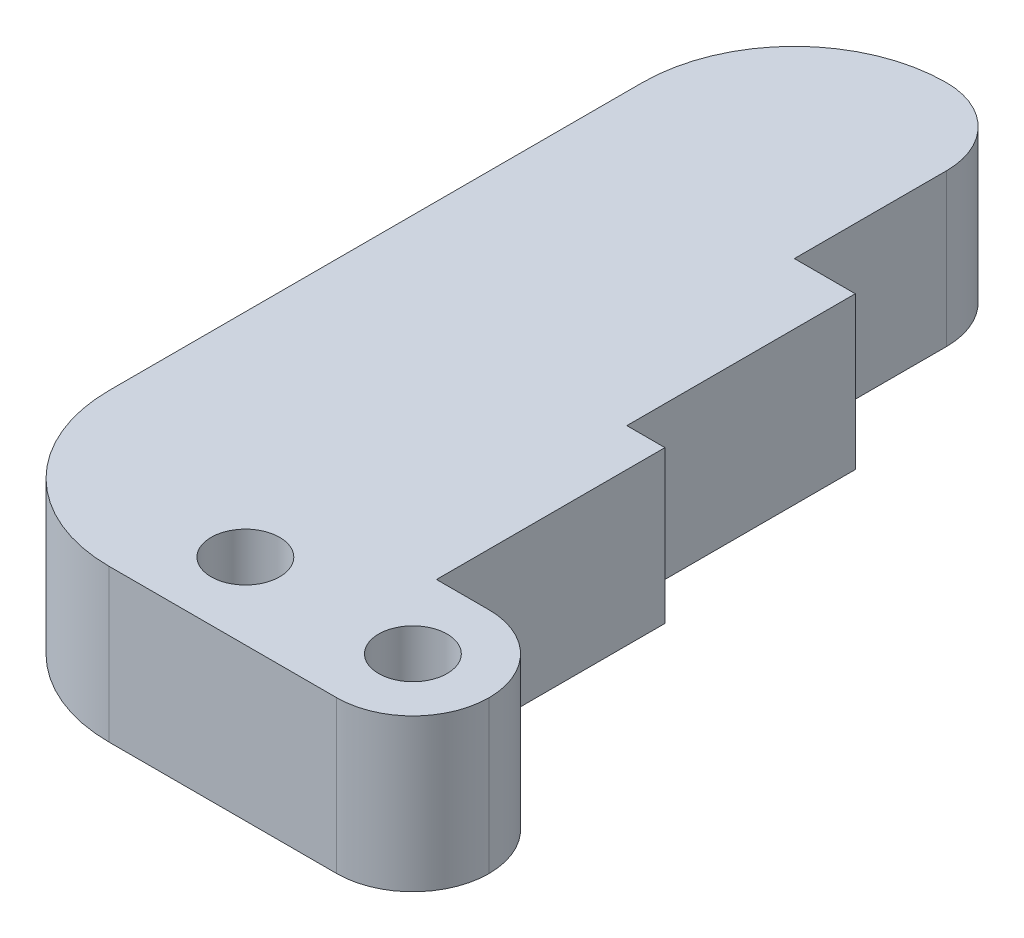
ISO-10303-21;
HEADER;
FILE_DESCRIPTION(('STEP AP214'),'2;1');
FILE_NAME('part.step','',(''),(''),'','','');
FILE_SCHEMA(('AUTOMOTIVE_DESIGN { 1 0 10303 214 1 1 1 1 }'));
ENDSEC;
DATA;
#1=APPLICATION_CONTEXT('core data for automotive mechanical design processes');
#2=APPLICATION_PROTOCOL_DEFINITION('international standard','automotive_design',2000,#1);
#3=PRODUCT_CONTEXT('',#1,'mechanical');
#4=PRODUCT('Part','Part','',(#3));
#5=PRODUCT_RELATED_PRODUCT_CATEGORY('part','',(#4));
#6=PRODUCT_DEFINITION_FORMATION('','',#4);
#7=PRODUCT_DEFINITION_CONTEXT('part definition',#1,'design');
#8=PRODUCT_DEFINITION('design','',#6,#7);
#9=PRODUCT_DEFINITION_SHAPE('','',#8);
#10=(LENGTH_UNIT() NAMED_UNIT(*) SI_UNIT(.MILLI.,.METRE.));
#11=(NAMED_UNIT(*) PLANE_ANGLE_UNIT() SI_UNIT($,.RADIAN.));
#12=(NAMED_UNIT(*) SI_UNIT($,.STERADIAN.) SOLID_ANGLE_UNIT());
#13=UNCERTAINTY_MEASURE_WITH_UNIT(LENGTH_MEASURE(1.E-05),#10,'distance_accuracy_value','');
#14=(GEOMETRIC_REPRESENTATION_CONTEXT(3) GLOBAL_UNCERTAINTY_ASSIGNED_CONTEXT((#13)) GLOBAL_UNIT_ASSIGNED_CONTEXT((#10,
#11,#12)) REPRESENTATION_CONTEXT('',''));
#15=CARTESIAN_POINT('',(0.,0.,0.));
#16=DIRECTION('',(0.,0.,1.));
#17=DIRECTION('',(1.,0.,0.));
#18=AXIS2_PLACEMENT_3D('',#15,#16,#17);
#19=CARTESIAN_POINT('',(-8.44999999999998,10.,0.));
#20=DIRECTION('',(0.,0.,1.));
#21=DIRECTION('',(1.,0.,0.));
#22=AXIS2_PLACEMENT_3D('',#19,#20,#21);
#23=PLANE('',#22);
#24=DIRECTION('',(-1.,0.,0.));
#25=VECTOR('',#24,1.);
#26=CARTESIAN_POINT('',(-8.44999999999998,10.,0.));
#27=LINE('',#26,#25);
#28=CARTESIAN_POINT('',(-5.,10.,0.));
#29=VERTEX_POINT('',#28);
#30=CARTESIAN_POINT('',(-8.44999999999998,10.,0.));
#31=VERTEX_POINT('',#30);
#32=EDGE_CURVE('E125',#29,#31,#27,.T.);
#33=ORIENTED_EDGE('',*,*,#32,.F.);
#34=DIRECTION('',(0.,-1.,0.));
#35=VECTOR('',#34,1.);
#36=CARTESIAN_POINT('',(-5.,10.,0.));
#37=LINE('',#36,#35);
#38=CARTESIAN_POINT('',(-5.,0.,0.));
#39=VERTEX_POINT('',#38);
#40=EDGE_CURVE('E42',#29,#39,#37,.T.);
#41=ORIENTED_EDGE('',*,*,#40,.T.);
#42=DIRECTION('',(-1.,0.,0.));
#43=VECTOR('',#42,1.);
#44=CARTESIAN_POINT('',(-8.44999999999998,0.,0.));
#45=LINE('',#44,#43);
#46=CARTESIAN_POINT('',(-8.44999999999998,0.,0.));
#47=VERTEX_POINT('',#46);
#48=EDGE_CURVE('E147',#39,#47,#45,.T.);
#49=ORIENTED_EDGE('',*,*,#48,.T.);
#50=DIRECTION('',(0.,-1.,0.));
#51=VECTOR('',#50,1.);
#52=CARTESIAN_POINT('',(-8.44999999999998,10.,0.));
#53=LINE('',#52,#51);
#54=EDGE_CURVE('E140',#31,#47,#53,.T.);
#55=ORIENTED_EDGE('',*,*,#54,.F.);
#56=EDGE_LOOP('',(#33,#41,#49,#55));
#57=FACE_BOUND('',#56,.T.);
#58=ADVANCED_FACE('F33',(#57),#23,.F.);
#59=CARTESIAN_POINT('',(-8.44999999999999,10.,-15.));
#60=DIRECTION('',(-1.,0.,0.));
#61=DIRECTION('',(0.,0.,1.));
#62=AXIS2_PLACEMENT_3D('',#59,#60,#61);
#63=PLANE('',#62);
#64=DIRECTION('',(0.,0.,-1.));
#65=VECTOR('',#64,1.);
#66=CARTESIAN_POINT('',(-8.44999999999999,0.,-15.));
#67=LINE('',#66,#65);
#68=CARTESIAN_POINT('',(-8.44999999999999,0.,-15.));
#69=VERTEX_POINT('',#68);
#70=EDGE_CURVE('E191',#47,#69,#67,.T.);
#71=ORIENTED_EDGE('',*,*,#70,.T.);
#72=DIRECTION('',(0.,-1.,0.));
#73=VECTOR('',#72,1.);
#74=CARTESIAN_POINT('',(-8.44999999999999,10.,-15.));
#75=LINE('',#74,#73);
#76=CARTESIAN_POINT('',(-8.44999999999999,10.,-15.));
#77=VERTEX_POINT('',#76);
#78=EDGE_CURVE('E142',#77,#69,#75,.T.);
#79=ORIENTED_EDGE('',*,*,#78,.F.);
#80=DIRECTION('',(0.,0.,-1.));
#81=VECTOR('',#80,1.);
#82=CARTESIAN_POINT('',(-8.44999999999999,10.,-15.));
#83=LINE('',#82,#81);
#84=EDGE_CURVE('E129',#31,#77,#83,.T.);
#85=ORIENTED_EDGE('',*,*,#84,.F.);
#86=ORIENTED_EDGE('',*,*,#54,.T.);
#87=EDGE_LOOP('',(#71,#79,#85,#86));
#88=FACE_BOUND('',#87,.T.);
#89=ADVANCED_FACE('F139',(#88),#63,.F.);
#90=CARTESIAN_POINT('',(-8.44999999999999,10.,-15.));
#91=DIRECTION('',(0.,0.,1.));
#92=DIRECTION('',(1.,0.,0.));
#93=AXIS2_PLACEMENT_3D('',#90,#91,#92);
#94=PLANE('',#93);
#95=DIRECTION('',(-1.,0.,0.));
#96=VECTOR('',#95,1.);
#97=CARTESIAN_POINT('',(-8.44999999999999,0.,-15.));
#98=LINE('',#97,#96);
#99=CARTESIAN_POINT('',(-10.95,0.,-15.));
#100=VERTEX_POINT('',#99);
#101=EDGE_CURVE('E194',#69,#100,#98,.T.);
#102=ORIENTED_EDGE('',*,*,#101,.T.);
#103=DIRECTION('',(0.,-1.,0.));
#104=VECTOR('',#103,1.);
#105=CARTESIAN_POINT('',(-10.95,10.,-15.));
#106=LINE('',#105,#104);
#107=CARTESIAN_POINT('',(-10.95,10.,-15.));
#108=VERTEX_POINT('',#107);
#109=EDGE_CURVE('E153',#108,#100,#106,.T.);
#110=ORIENTED_EDGE('',*,*,#109,.F.);
#111=DIRECTION('',(-1.,0.,0.));
#112=VECTOR('',#111,1.);
#113=CARTESIAN_POINT('',(-8.44999999999999,10.,-15.));
#114=LINE('',#113,#112);
#115=EDGE_CURVE('E144',#77,#108,#114,.T.);
#116=ORIENTED_EDGE('',*,*,#115,.F.);
#117=ORIENTED_EDGE('',*,*,#78,.T.);
#118=EDGE_LOOP('',(#102,#110,#116,#117));
#119=FACE_BOUND('',#118,.T.);
#120=ADVANCED_FACE('F289',(#119),#94,.F.);
#121=CARTESIAN_POINT('',(-10.95,10.,-15.));
#122=DIRECTION('',(-1.,0.,0.));
#123=DIRECTION('',(0.,0.,1.));
#124=AXIS2_PLACEMENT_3D('',#121,#122,#123);
#125=PLANE('',#124);
#126=DIRECTION('',(0.,0.,-1.));
#127=VECTOR('',#126,1.);
#128=CARTESIAN_POINT('',(-10.95,0.,-15.));
#129=LINE('',#128,#127);
#130=CARTESIAN_POINT('',(-10.95,0.,-30.));
#131=VERTEX_POINT('',#130);
#132=EDGE_CURVE('E204',#100,#131,#129,.T.);
#133=ORIENTED_EDGE('',*,*,#132,.T.);
#134=DIRECTION('',(0.,-1.,0.));
#135=VECTOR('',#134,1.);
#136=CARTESIAN_POINT('',(-10.95,10.,-30.));
#137=LINE('',#136,#135);
#138=CARTESIAN_POINT('',(-10.95,10.,-30.));
#139=VERTEX_POINT('',#138);
#140=EDGE_CURVE('E219',#139,#131,#137,.T.);
#141=ORIENTED_EDGE('',*,*,#140,.F.);
#142=DIRECTION('',(0.,0.,-1.));
#143=VECTOR('',#142,1.);
#144=CARTESIAN_POINT('',(-10.95,10.,-15.));
#145=LINE('',#144,#143);
#146=EDGE_CURVE('E228',#108,#139,#145,.T.);
#147=ORIENTED_EDGE('',*,*,#146,.F.);
#148=ORIENTED_EDGE('',*,*,#109,.T.);
#149=EDGE_LOOP('',(#133,#141,#147,#148));
#150=FACE_BOUND('',#149,.T.);
#151=ADVANCED_FACE('F226',(#150),#125,.F.);
#152=CARTESIAN_POINT('',(-10.95,10.,-30.));
#153=DIRECTION('',(0.,0.,1.));
#154=DIRECTION('',(1.,0.,0.));
#155=AXIS2_PLACEMENT_3D('',#152,#153,#154);
#156=PLANE('',#155);
#157=DIRECTION('',(-1.,0.,0.));
#158=VECTOR('',#157,1.);
#159=CARTESIAN_POINT('',(-10.95,0.,-30.));
#160=LINE('',#159,#158);
#161=CARTESIAN_POINT('',(-14.95,0.,-30.));
#162=VERTEX_POINT('',#161);
#163=EDGE_CURVE('E206',#131,#162,#160,.T.);
#164=ORIENTED_EDGE('',*,*,#163,.T.);
#165=DIRECTION('',(0.,-1.,0.));
#166=VECTOR('',#165,1.);
#167=CARTESIAN_POINT('',(-14.95,10.,-30.));
#168=LINE('',#167,#166);
#169=CARTESIAN_POINT('',(-14.95,10.,-30.));
#170=VERTEX_POINT('',#169);
#171=EDGE_CURVE('E216',#170,#162,#168,.T.);
#172=ORIENTED_EDGE('',*,*,#171,.F.);
#173=DIRECTION('',(-1.,0.,0.));
#174=VECTOR('',#173,1.);
#175=CARTESIAN_POINT('',(-10.95,10.,-30.));
#176=LINE('',#175,#174);
#177=EDGE_CURVE('E243',#139,#170,#176,.T.);
#178=ORIENTED_EDGE('',*,*,#177,.F.);
#179=ORIENTED_EDGE('',*,*,#140,.T.);
#180=EDGE_LOOP('',(#164,#172,#178,#179));
#181=FACE_BOUND('',#180,.T.);
#182=ADVANCED_FACE('F234',(#181),#156,.F.);
#183=CARTESIAN_POINT('',(-14.95,10.,-30.));
#184=DIRECTION('',(-1.,0.,0.));
#185=DIRECTION('',(0.,0.,1.));
#186=AXIS2_PLACEMENT_3D('',#183,#184,#185);
#187=PLANE('',#186);
#188=DIRECTION('',(0.,0.,-1.));
#189=VECTOR('',#188,1.);
#190=CARTESIAN_POINT('',(-14.95,0.,-30.));
#191=LINE('',#190,#189);
#192=CARTESIAN_POINT('',(-14.95,0.,-40.));
#193=VERTEX_POINT('',#192);
#194=EDGE_CURVE('E208',#162,#193,#191,.T.);
#195=ORIENTED_EDGE('',*,*,#194,.T.);
#196=DIRECTION('',(0.,-1.,0.));
#197=VECTOR('',#196,1.);
#198=CARTESIAN_POINT('',(-14.95,10.,-40.));
#199=LINE('',#198,#197);
#200=CARTESIAN_POINT('',(-14.95,10.,-40.));
#201=VERTEX_POINT('',#200);
#202=EDGE_CURVE('E180',#193,#201,#199,.F.);
#203=ORIENTED_EDGE('',*,*,#202,.T.);
#204=DIRECTION('',(0.,0.,-1.));
#205=VECTOR('',#204,1.);
#206=CARTESIAN_POINT('',(-14.95,10.,-30.));
#207=LINE('',#206,#205);
#208=EDGE_CURVE('E240',#170,#201,#207,.T.);
#209=ORIENTED_EDGE('',*,*,#208,.F.);
#210=ORIENTED_EDGE('',*,*,#171,.T.);
#211=EDGE_LOOP('',(#195,#203,#209,#210));
#212=FACE_BOUND('',#211,.T.);
#213=ADVANCED_FACE('F238',(#212),#187,.F.);
#214=CARTESIAN_POINT('',(-29.95,10.,-45.));
#215=DIRECTION('',(1.,0.,0.));
#216=DIRECTION('',(0.,0.,-1.));
#217=AXIS2_PLACEMENT_3D('',#214,#215,#216);
#218=PLANE('',#217);
#219=DIRECTION('',(0.,0.,1.));
#220=VECTOR('',#219,1.);
#221=CARTESIAN_POINT('',(-29.95,10.,-45.));
#222=LINE('',#221,#220);
#223=CARTESIAN_POINT('',(-29.95,10.,-35.));
#224=VERTEX_POINT('',#223);
#225=CARTESIAN_POINT('',(-29.95,10.,0.));
#226=VERTEX_POINT('',#225);
#227=EDGE_CURVE('E242',#224,#226,#222,.T.);
#228=ORIENTED_EDGE('',*,*,#227,.F.);
#229=DIRECTION('',(0.,-1.,0.));
#230=VECTOR('',#229,1.);
#231=CARTESIAN_POINT('',(-29.95,10.,-35.));
#232=LINE('',#231,#230);
#233=CARTESIAN_POINT('',(-29.95,0.,-35.));
#234=VERTEX_POINT('',#233);
#235=EDGE_CURVE('E151',#224,#234,#232,.T.);
#236=ORIENTED_EDGE('',*,*,#235,.T.);
#237=DIRECTION('',(0.,0.,1.));
#238=VECTOR('',#237,1.);
#239=CARTESIAN_POINT('',(-29.95,0.,-45.));
#240=LINE('',#239,#238);
#241=CARTESIAN_POINT('',(-29.95,0.,0.));
#242=VERTEX_POINT('',#241);
#243=EDGE_CURVE('E211',#234,#242,#240,.T.);
#244=ORIENTED_EDGE('',*,*,#243,.T.);
#245=DIRECTION('',(0.,-1.,0.));
#246=VECTOR('',#245,1.);
#247=CARTESIAN_POINT('',(-29.95,10.,0.));
#248=LINE('',#247,#246);
#249=EDGE_CURVE('E149',#242,#226,#248,.F.);
#250=ORIENTED_EDGE('',*,*,#249,.T.);
#251=EDGE_LOOP('',(#228,#236,#244,#250));
#252=FACE_BOUND('',#251,.T.);
#253=ADVANCED_FACE('F320',(#252),#218,.F.);
#254=CARTESIAN_POINT('',(0.,10.,10.));
#255=DIRECTION('',(0.,0.,-1.));
#256=DIRECTION('',(-1.,0.,0.));
#257=AXIS2_PLACEMENT_3D('',#254,#255,#256);
#258=PLANE('',#257);
#259=DIRECTION('',(1.,0.,0.));
#260=VECTOR('',#259,1.);
#261=CARTESIAN_POINT('',(0.,0.,10.));
#262=LINE('',#261,#260);
#263=CARTESIAN_POINT('',(-19.95,0.,10.));
#264=VERTEX_POINT('',#263);
#265=CARTESIAN_POINT('',(-5.,0.,10.));
#266=VERTEX_POINT('',#265);
#267=EDGE_CURVE('E135',#264,#266,#262,.T.);
#268=ORIENTED_EDGE('',*,*,#267,.T.);
#269=DIRECTION('',(0.,-1.,0.));
#270=VECTOR('',#269,1.);
#271=CARTESIAN_POINT('',(-5.,10.,10.));
#272=LINE('',#271,#270);
#273=CARTESIAN_POINT('',(-5.,10.,10.));
#274=VERTEX_POINT('',#273);
#275=EDGE_CURVE('E11',#266,#274,#272,.F.);
#276=ORIENTED_EDGE('',*,*,#275,.T.);
#277=DIRECTION('',(1.,0.,0.));
#278=VECTOR('',#277,1.);
#279=CARTESIAN_POINT('',(0.,10.,10.));
#280=LINE('',#279,#278);
#281=CARTESIAN_POINT('',(-19.95,10.,10.));
#282=VERTEX_POINT('',#281);
#283=EDGE_CURVE('E200',#282,#274,#280,.T.);
#284=ORIENTED_EDGE('',*,*,#283,.F.);
#285=DIRECTION('',(0.,-1.,0.));
#286=VECTOR('',#285,1.);
#287=CARTESIAN_POINT('',(-19.95,10.,10.));
#288=LINE('',#287,#286);
#289=EDGE_CURVE('E171',#282,#264,#288,.T.);
#290=ORIENTED_EDGE('',*,*,#289,.T.);
#291=EDGE_LOOP('',(#268,#276,#284,#290));
#292=FACE_BOUND('',#291,.T.);
#293=ADVANCED_FACE('F263',(#292),#258,.F.);
#294=CARTESIAN_POINT('',(0.,10.,0.));
#295=DIRECTION('',(0.,-1.,0.));
#296=DIRECTION('',(0.,0.,-1.));
#297=AXIS2_PLACEMENT_3D('',#294,#295,#296);
#298=PLANE('',#297);
#299=CARTESIAN_POINT('',(-16.,10.,5.));
#300=DIRECTION('',(0.,1.,0.));
#301=DIRECTION('',(0.,0.,1.));
#302=AXIS2_PLACEMENT_3D('',#299,#300,#301);
#303=CIRCLE('',#302,2.25);
#304=CARTESIAN_POINT('',(-16.,10.,7.25));
#305=VERTEX_POINT('',#304);
#306=EDGE_CURVE('E197',#305,#305,#303,.T.);
#307=ORIENTED_EDGE('',*,*,#306,.F.);
#308=EDGE_LOOP('',(#307));
#309=FACE_BOUND('',#308,.T.);
#310=CARTESIAN_POINT('',(-4.99999999999999,10.,5.));
#311=DIRECTION('',(0.,1.,0.));
#312=DIRECTION('',(0.,0.,1.));
#313=AXIS2_PLACEMENT_3D('',#310,#311,#312);
#314=CIRCLE('',#313,2.25);
#315=CARTESIAN_POINT('',(-4.99999999999999,10.,7.25));
#316=VERTEX_POINT('',#315);
#317=EDGE_CURVE('E250',#316,#316,#314,.T.);
#318=ORIENTED_EDGE('',*,*,#317,.F.);
#319=EDGE_LOOP('',(#318));
#320=FACE_BOUND('',#319,.T.);
#321=ORIENTED_EDGE('',*,*,#208,.T.);
#322=CARTESIAN_POINT('',(-19.95,10.,-40.));
#323=DIRECTION('',(0.,-1.,0.));
#324=DIRECTION('',(0.,0.,-1.));
#325=AXIS2_PLACEMENT_3D('',#322,#323,#324);
#326=CIRCLE('',#325,5.);
#327=CARTESIAN_POINT('',(-19.95,10.,-45.));
#328=VERTEX_POINT('',#327);
#329=EDGE_CURVE('E184',#201,#328,#326,.F.);
#330=ORIENTED_EDGE('',*,*,#329,.T.);
#331=CARTESIAN_POINT('',(-19.95,10.,-35.));
#332=DIRECTION('',(0.,-1.,0.));
#333=DIRECTION('',(0.,0.,-1.));
#334=AXIS2_PLACEMENT_3D('',#331,#332,#333);
#335=CIRCLE('',#334,10.);
#336=EDGE_CURVE('E169',#328,#224,#335,.F.);
#337=ORIENTED_EDGE('',*,*,#336,.T.);
#338=ORIENTED_EDGE('',*,*,#227,.T.);
#339=CARTESIAN_POINT('',(-19.95,10.,0.));
#340=DIRECTION('',(0.,-1.,0.));
#341=DIRECTION('',(0.,0.,-1.));
#342=AXIS2_PLACEMENT_3D('',#339,#340,#341);
#343=CIRCLE('',#342,10.);
#344=EDGE_CURVE('E167',#226,#282,#343,.F.);
#345=ORIENTED_EDGE('',*,*,#344,.T.);
#346=ORIENTED_EDGE('',*,*,#283,.T.);
#347=CARTESIAN_POINT('',(-5.,10.,5.));
#348=DIRECTION('',(0.,-1.,0.));
#349=DIRECTION('',(0.,0.,-1.));
#350=AXIS2_PLACEMENT_3D('',#347,#348,#349);
#351=CIRCLE('',#350,5.);
#352=CARTESIAN_POINT('',(0.,10.,5.));
#353=VERTEX_POINT('',#352);
#354=EDGE_CURVE('E54',#274,#353,#351,.F.);
#355=ORIENTED_EDGE('',*,*,#354,.T.);
#356=CARTESIAN_POINT('',(-5.,10.,5.));
#357=DIRECTION('',(0.,-1.,0.));
#358=DIRECTION('',(0.,0.,-1.));
#359=AXIS2_PLACEMENT_3D('',#356,#357,#358);
#360=CIRCLE('',#359,5.);
#361=EDGE_CURVE('E49',#353,#29,#360,.F.);
#362=ORIENTED_EDGE('',*,*,#361,.T.);
#363=ORIENTED_EDGE('',*,*,#32,.T.);
#364=ORIENTED_EDGE('',*,*,#84,.T.);
#365=ORIENTED_EDGE('',*,*,#115,.T.);
#366=ORIENTED_EDGE('',*,*,#146,.T.);
#367=ORIENTED_EDGE('',*,*,#177,.T.);
#368=EDGE_LOOP('',(#321,#330,#337,#338,#345,#346,#355,#362,#363,#364,#365,#366,#367));
#369=FACE_BOUND('',#368,.T.);
#370=ADVANCED_FACE('F128',(#309,#320,#369),#298,.F.);
#371=CARTESIAN_POINT('',(0.,0.,0.));
#372=DIRECTION('',(0.,-1.,0.));
#373=DIRECTION('',(0.,0.,-1.));
#374=AXIS2_PLACEMENT_3D('',#371,#372,#373);
#375=PLANE('',#374);
#376=CARTESIAN_POINT('',(-16.,0.,5.));
#377=DIRECTION('',(0.,1.,0.));
#378=DIRECTION('',(0.,0.,1.));
#379=AXIS2_PLACEMENT_3D('',#376,#377,#378);
#380=CIRCLE('',#379,2.25);
#381=CARTESIAN_POINT('',(-16.,0.,7.25));
#382=VERTEX_POINT('',#381);
#383=EDGE_CURVE('E192',#382,#382,#380,.T.);
#384=ORIENTED_EDGE('',*,*,#383,.T.);
#385=EDGE_LOOP('',(#384));
#386=FACE_BOUND('',#385,.T.);
#387=CARTESIAN_POINT('',(-4.99999999999999,0.,5.));
#388=DIRECTION('',(0.,1.,0.));
#389=DIRECTION('',(0.,0.,1.));
#390=AXIS2_PLACEMENT_3D('',#387,#388,#389);
#391=CIRCLE('',#390,2.25);
#392=CARTESIAN_POINT('',(-4.99999999999999,0.,7.25));
#393=VERTEX_POINT('',#392);
#394=EDGE_CURVE('E253',#393,#393,#391,.T.);
#395=ORIENTED_EDGE('',*,*,#394,.T.);
#396=EDGE_LOOP('',(#395));
#397=FACE_BOUND('',#396,.T.);
#398=CARTESIAN_POINT('',(-19.95,0.,-35.));
#399=DIRECTION('',(0.,-1.,0.));
#400=DIRECTION('',(0.,0.,-1.));
#401=AXIS2_PLACEMENT_3D('',#398,#399,#400);
#402=CIRCLE('',#401,10.);
#403=CARTESIAN_POINT('',(-19.95,0.,-45.));
#404=VERTEX_POINT('',#403);
#405=EDGE_CURVE('E161',#234,#404,#402,.T.);
#406=ORIENTED_EDGE('',*,*,#405,.T.);
#407=CARTESIAN_POINT('',(-19.95,0.,-40.));
#408=DIRECTION('',(0.,-1.,0.));
#409=DIRECTION('',(0.,0.,-1.));
#410=AXIS2_PLACEMENT_3D('',#407,#408,#409);
#411=CIRCLE('',#410,5.);
#412=EDGE_CURVE('E178',#404,#193,#411,.T.);
#413=ORIENTED_EDGE('',*,*,#412,.T.);
#414=ORIENTED_EDGE('',*,*,#194,.F.);
#415=ORIENTED_EDGE('',*,*,#163,.F.);
#416=ORIENTED_EDGE('',*,*,#132,.F.);
#417=ORIENTED_EDGE('',*,*,#101,.F.);
#418=ORIENTED_EDGE('',*,*,#70,.F.);
#419=ORIENTED_EDGE('',*,*,#48,.F.);
#420=CARTESIAN_POINT('',(-5.,0.,5.));
#421=DIRECTION('',(0.,-1.,0.));
#422=DIRECTION('',(0.,0.,-1.));
#423=AXIS2_PLACEMENT_3D('',#420,#421,#422);
#424=CIRCLE('',#423,5.);
#425=CARTESIAN_POINT('',(0.,0.,5.));
#426=VERTEX_POINT('',#425);
#427=EDGE_CURVE('E176',#39,#426,#424,.T.);
#428=ORIENTED_EDGE('',*,*,#427,.T.);
#429=CARTESIAN_POINT('',(-5.,0.,5.));
#430=DIRECTION('',(0.,-1.,0.));
#431=DIRECTION('',(0.,0.,-1.));
#432=AXIS2_PLACEMENT_3D('',#429,#430,#431);
#433=CIRCLE('',#432,5.);
#434=EDGE_CURVE('E174',#426,#266,#433,.T.);
#435=ORIENTED_EDGE('',*,*,#434,.T.);
#436=ORIENTED_EDGE('',*,*,#267,.F.);
#437=CARTESIAN_POINT('',(-19.95,0.,0.));
#438=DIRECTION('',(0.,-1.,0.));
#439=DIRECTION('',(0.,0.,-1.));
#440=AXIS2_PLACEMENT_3D('',#437,#438,#439);
#441=CIRCLE('',#440,10.);
#442=EDGE_CURVE('E159',#264,#242,#441,.T.);
#443=ORIENTED_EDGE('',*,*,#442,.T.);
#444=ORIENTED_EDGE('',*,*,#243,.F.);
#445=EDGE_LOOP('',(#406,#413,#414,#415,#416,#417,#418,#419,#428,#435,#436,#443,#444));
#446=FACE_BOUND('',#445,.T.);
#447=ADVANCED_FACE('F188',(#386,#397,#446),#375,.T.);
#448=CARTESIAN_POINT('',(-4.99999999999999,0.,5.));
#449=DIRECTION('',(0.,1.,0.));
#450=DIRECTION('',(0.,0.,1.));
#451=AXIS2_PLACEMENT_3D('',#448,#449,#450);
#452=CYLINDRICAL_SURFACE('',#451,2.25);
#453=ORIENTED_EDGE('',*,*,#394,.F.);
#454=EDGE_LOOP('',(#453));
#455=FACE_BOUND('',#454,.T.);
#456=ORIENTED_EDGE('',*,*,#317,.T.);
#457=EDGE_LOOP('',(#456));
#458=FACE_BOUND('',#457,.T.);
#459=ADVANCED_FACE('F267',(#455,#458),#452,.F.);
#460=CARTESIAN_POINT('',(-16.,0.,5.));
#461=DIRECTION('',(0.,1.,0.));
#462=DIRECTION('',(0.,0.,1.));
#463=AXIS2_PLACEMENT_3D('',#460,#461,#462);
#464=CYLINDRICAL_SURFACE('',#463,2.25);
#465=ORIENTED_EDGE('',*,*,#383,.F.);
#466=EDGE_LOOP('',(#465));
#467=FACE_BOUND('',#466,.T.);
#468=ORIENTED_EDGE('',*,*,#306,.T.);
#469=EDGE_LOOP('',(#468));
#470=FACE_BOUND('',#469,.T.);
#471=ADVANCED_FACE('F259',(#467,#470),#464,.F.);
#472=CARTESIAN_POINT('',(-19.95,10.,-35.));
#473=DIRECTION('',(0.,-1.,0.));
#474=DIRECTION('',(0.,0.,-1.));
#475=AXIS2_PLACEMENT_3D('',#472,#473,#474);
#476=CYLINDRICAL_SURFACE('',#475,10.);
#477=ORIENTED_EDGE('',*,*,#336,.F.);
#478=DIRECTION('',(0.,-1.,0.));
#479=VECTOR('',#478,1.);
#480=CARTESIAN_POINT('',(-19.95,10.,-45.));
#481=LINE('',#480,#479);
#482=EDGE_CURVE('E164',#404,#328,#481,.F.);
#483=ORIENTED_EDGE('',*,*,#482,.F.);
#484=ORIENTED_EDGE('',*,*,#405,.F.);
#485=ORIENTED_EDGE('',*,*,#235,.F.);
#486=EDGE_LOOP('',(#477,#483,#484,#485));
#487=FACE_BOUND('',#486,.T.);
#488=ADVANCED_FACE('F275',(#487),#476,.T.);
#489=CARTESIAN_POINT('',(-19.95,10.,0.));
#490=DIRECTION('',(0.,-1.,0.));
#491=DIRECTION('',(0.,0.,-1.));
#492=AXIS2_PLACEMENT_3D('',#489,#490,#491);
#493=CYLINDRICAL_SURFACE('',#492,10.);
#494=ORIENTED_EDGE('',*,*,#344,.F.);
#495=ORIENTED_EDGE('',*,*,#249,.F.);
#496=ORIENTED_EDGE('',*,*,#442,.F.);
#497=ORIENTED_EDGE('',*,*,#289,.F.);
#498=EDGE_LOOP('',(#494,#495,#496,#497));
#499=FACE_BOUND('',#498,.T.);
#500=ADVANCED_FACE('F295',(#499),#493,.T.);
#501=CARTESIAN_POINT('',(-19.95,10.,-40.));
#502=DIRECTION('',(0.,-1.,0.));
#503=DIRECTION('',(0.,0.,-1.));
#504=AXIS2_PLACEMENT_3D('',#501,#502,#503);
#505=CYLINDRICAL_SURFACE('',#504,5.);
#506=ORIENTED_EDGE('',*,*,#329,.F.);
#507=ORIENTED_EDGE('',*,*,#202,.F.);
#508=ORIENTED_EDGE('',*,*,#412,.F.);
#509=ORIENTED_EDGE('',*,*,#482,.T.);
#510=EDGE_LOOP('',(#506,#507,#508,#509));
#511=FACE_BOUND('',#510,.T.);
#512=ADVANCED_FACE('F299',(#511),#505,.T.);
#513=CARTESIAN_POINT('',(-5.,10.,5.));
#514=DIRECTION('',(0.,-1.,0.));
#515=DIRECTION('',(0.,0.,-1.));
#516=AXIS2_PLACEMENT_3D('',#513,#514,#515);
#517=CYLINDRICAL_SURFACE('',#516,5.);
#518=DIRECTION('',(0.,-1.,0.));
#519=VECTOR('',#518,1.);
#520=CARTESIAN_POINT('',(0.,10.,5.));
#521=LINE('',#520,#519);
#522=EDGE_CURVE('E37',#353,#426,#521,.T.);
#523=ORIENTED_EDGE('',*,*,#522,.F.);
#524=ORIENTED_EDGE('',*,*,#354,.F.);
#525=ORIENTED_EDGE('',*,*,#275,.F.);
#526=ORIENTED_EDGE('',*,*,#434,.F.);
#527=EDGE_LOOP('',(#523,#524,#525,#526));
#528=FACE_BOUND('',#527,.T.);
#529=ADVANCED_FACE('F35',(#528),#517,.T.);
#530=CARTESIAN_POINT('',(-5.,10.,5.));
#531=DIRECTION('',(0.,-1.,0.));
#532=DIRECTION('',(0.,0.,-1.));
#533=AXIS2_PLACEMENT_3D('',#530,#531,#532);
#534=CYLINDRICAL_SURFACE('',#533,5.);
#535=ORIENTED_EDGE('',*,*,#361,.F.);
#536=ORIENTED_EDGE('',*,*,#522,.T.);
#537=ORIENTED_EDGE('',*,*,#427,.F.);
#538=ORIENTED_EDGE('',*,*,#40,.F.);
#539=EDGE_LOOP('',(#535,#536,#537,#538));
#540=FACE_BOUND('',#539,.T.);
#541=ADVANCED_FACE('F303',(#540),#534,.T.);
#542=CLOSED_SHELL('',(#58,#89,#120,#151,#182,#213,#253,#293,#370,#447,#459,#471,#488,#500,#512,
#529,#541));
#543=MANIFOLD_SOLID_BREP('B2',#542);
#544=ADVANCED_BREP_SHAPE_REPRESENTATION('',(#18,#543),#14);
#545=SHAPE_DEFINITION_REPRESENTATION(#9,#544);
ENDSEC;
END-ISO-10303-21;
